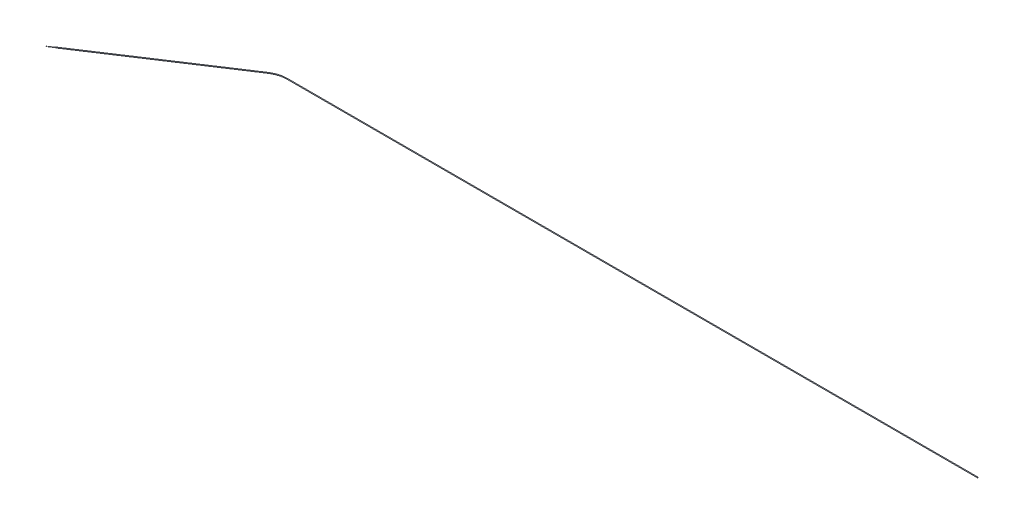
ISO-10303-21;
HEADER;
FILE_DESCRIPTION(('STEP AP214'),'2;1');
FILE_NAME('part.step','',(''),(''),'','','');
FILE_SCHEMA(('AUTOMOTIVE_DESIGN { 1 0 10303 214 1 1 1 1 }'));
ENDSEC;
DATA;
#1=APPLICATION_CONTEXT('core data for automotive mechanical design processes');
#2=APPLICATION_PROTOCOL_DEFINITION('international standard','automotive_design',2000,#1);
#3=PRODUCT_CONTEXT('',#1,'mechanical');
#4=PRODUCT('Part','Part','',(#3));
#5=PRODUCT_RELATED_PRODUCT_CATEGORY('part','',(#4));
#6=PRODUCT_DEFINITION_FORMATION('','',#4);
#7=PRODUCT_DEFINITION_CONTEXT('part definition',#1,'design');
#8=PRODUCT_DEFINITION('design','',#6,#7);
#9=PRODUCT_DEFINITION_SHAPE('','',#8);
#10=(LENGTH_UNIT() NAMED_UNIT(*) SI_UNIT(.MILLI.,.METRE.));
#11=(NAMED_UNIT(*) PLANE_ANGLE_UNIT() SI_UNIT($,.RADIAN.));
#12=(NAMED_UNIT(*) SI_UNIT($,.STERADIAN.) SOLID_ANGLE_UNIT());
#13=UNCERTAINTY_MEASURE_WITH_UNIT(LENGTH_MEASURE(1.E-05),#10,'distance_accuracy_value','');
#14=(GEOMETRIC_REPRESENTATION_CONTEXT(3) GLOBAL_UNCERTAINTY_ASSIGNED_CONTEXT((#13)) GLOBAL_UNIT_ASSIGNED_CONTEXT((#10,
#11,#12)) REPRESENTATION_CONTEXT('',''));
#15=CARTESIAN_POINT('',(0.,0.,0.));
#16=DIRECTION('',(0.,0.,1.));
#17=DIRECTION('',(1.,0.,0.));
#18=AXIS2_PLACEMENT_3D('',#15,#16,#17);
#19=CARTESIAN_POINT('',(500.,0.,-20.));
#20=DIRECTION('',(1.,0.,0.));
#21=DIRECTION('',(0.,0.,-1.));
#22=AXIS2_PLACEMENT_3D('',#19,#20,#21);
#23=PLANE('',#22);
#24=CARTESIAN_POINT('',(500.,0.,-20.));
#25=DIRECTION('',(1.,0.,0.));
#26=DIRECTION('',(0.,0.,-1.));
#27=AXIS2_PLACEMENT_3D('',#24,#25,#26);
#28=CIRCLE('',#27,0.249999999999997);
#29=CARTESIAN_POINT('',(500.,0.,-20.25));
#30=VERTEX_POINT('',#29);
#31=EDGE_CURVE('E59',#30,#30,#28,.T.);
#32=ORIENTED_EDGE('',*,*,#31,.T.);
#33=EDGE_LOOP('',(#32));
#34=FACE_BOUND('',#33,.T.);
#35=ADVANCED_FACE('F44',(#34),#23,.T.);
#36=CARTESIAN_POINT('',(-103.755073471841,0.,44.2253855704274));
#37=DIRECTION('',(0.835807361368269,0.,-0.549022817998133));
#38=DIRECTION('',(-0.549022817998133,0.,-0.835807361368269));
#39=AXIS2_PLACEMENT_3D('',#36,#37,#38);
#40=PLANE('',#39);
#41=CARTESIAN_POINT('',(-103.755073471841,0.,44.2253855704275));
#42=DIRECTION('',(-0.835807361368269,0.,0.549022817998133));
#43=DIRECTION('',(0.549022817998133,0.,0.835807361368269));
#44=AXIS2_PLACEMENT_3D('',#41,#42,#43);
#45=CIRCLE('',#44,0.1);
#46=CARTESIAN_POINT('',(-103.700171190041,0.,44.3089663065643));
#47=VERTEX_POINT('',#46);
#48=EDGE_CURVE('E11',#47,#47,#45,.T.);
#49=ORIENTED_EDGE('',*,*,#48,.F.);
#50=EDGE_LOOP('',(#49));
#51=FACE_BOUND('',#50,.T.);
#52=CARTESIAN_POINT('',(-103.755073471841,0.,44.2253855704274));
#53=DIRECTION('',(0.835807361368269,0.,-0.549022817998133));
#54=DIRECTION('',(-0.549022817998133,0.,-0.835807361368269));
#55=AXIS2_PLACEMENT_3D('',#52,#53,#54);
#56=CIRCLE('',#55,0.249999999999997);
#57=CARTESIAN_POINT('',(-103.89232917634,0.,44.0164337300854));
#58=VERTEX_POINT('',#57);
#59=EDGE_CURVE('E47',#58,#58,#56,.T.);
#60=ORIENTED_EDGE('',*,*,#59,.F.);
#61=EDGE_LOOP('',(#60));
#62=FACE_BOUND('',#61,.T.);
#63=ADVANCED_FACE('F85',(#51,#62),#40,.F.);
#64=CARTESIAN_POINT('',(500.,0.,-20.));
#65=DIRECTION('',(-1.,0.,0.));
#66=DIRECTION('',(0.,0.,1.));
#67=AXIS2_PLACEMENT_3D('',#64,#65,#66);
#68=CYLINDRICAL_SURFACE('',#67,0.249999999999997);
#69=CARTESIAN_POINT('',(0.,0.,-20.));
#70=DIRECTION('',(1.,0.,0.));
#71=DIRECTION('',(0.,0.,-1.));
#72=AXIS2_PLACEMENT_3D('',#69,#70,#71);
#73=CIRCLE('',#72,0.249999999999997);
#74=CARTESIAN_POINT('',(0.,0.,-20.25));
#75=VERTEX_POINT('',#74);
#76=EDGE_CURVE('E62',#75,#75,#73,.T.);
#77=ORIENTED_EDGE('',*,*,#76,.T.);
#78=EDGE_LOOP('',(#77));
#79=FACE_BOUND('',#78,.T.);
#80=ORIENTED_EDGE('',*,*,#31,.F.);
#81=EDGE_LOOP('',(#80));
#82=FACE_BOUND('',#81,.T.);
#83=ADVANCED_FACE('F82',(#79,#82),#68,.T.);
#84=CARTESIAN_POINT('',(0.,0.,0.));
#85=DIRECTION('',(0.,1.,0.));
#86=DIRECTION('',(0.,0.,1.));
#87=AXIS2_PLACEMENT_3D('',#84,#85,#86);
#88=TOROIDAL_SURFACE('',#87,20.,0.249999999999997);
#89=CARTESIAN_POINT('',(-10.9804563599627,0.,-16.7161472273653));
#90=DIRECTION('',(0.835807361368269,0.,-0.549022817998133));
#91=DIRECTION('',(-0.549022817998133,0.,-0.835807361368269));
#92=AXIS2_PLACEMENT_3D('',#89,#90,#91);
#93=CIRCLE('',#92,0.249999999999997);
#94=CARTESIAN_POINT('',(-11.1177120644622,0.,-16.9250990677074));
#95=VERTEX_POINT('',#94);
#96=EDGE_CURVE('E55',#95,#95,#93,.T.);
#97=CARTESIAN_POINT('',(0.,0.,0.));
#98=DIRECTION('',(0.,1.,0.));
#99=DIRECTION('',(0.,0.,1.));
#100=AXIS2_PLACEMENT_3D('',#97,#98,#99);
#101=CIRCLE('',#100,20.25);
#102=EDGE_CURVE('',#75,#95,#101,.T.);
#103=ORIENTED_EDGE('',*,*,#76,.F.);
#104=ORIENTED_EDGE('',*,*,#96,.T.);
#105=ORIENTED_EDGE('',*,*,#102,.T.);
#106=ORIENTED_EDGE('',*,*,#102,.F.);
#107=EDGE_LOOP('',(#103,#105,#104,#106));
#108=FACE_BOUND('',#107,.T.);
#109=ADVANCED_FACE('F67',(#108),#88,.T.);
#110=CARTESIAN_POINT('',(-10.9804563599627,0.,-16.7161472273654));
#111=DIRECTION('',(-0.835807361368269,0.,0.549022817998133));
#112=DIRECTION('',(0.549022817998133,0.,0.835807361368269));
#113=AXIS2_PLACEMENT_3D('',#110,#111,#112);
#114=CYLINDRICAL_SURFACE('',#113,0.249999999999997);
#115=ORIENTED_EDGE('',*,*,#59,.T.);
#116=EDGE_LOOP('',(#115));
#117=FACE_BOUND('',#116,.T.);
#118=ORIENTED_EDGE('',*,*,#96,.F.);
#119=EDGE_LOOP('',(#118));
#120=FACE_BOUND('',#119,.T.);
#121=ADVANCED_FACE('F70',(#117,#120),#114,.T.);
#122=CARTESIAN_POINT('',(-107.934110278682,0.,46.9704996604181));
#123=DIRECTION('',(0.835807361368269,0.,-0.549022817998133));
#124=DIRECTION('',(-0.549022817998133,0.,-0.835807361368269));
#125=AXIS2_PLACEMENT_3D('',#122,#123,#124);
#126=CYLINDRICAL_SURFACE('',#125,0.1);
#127=CARTESIAN_POINT('',(-107.934110278682,0.,46.9704996604181));
#128=DIRECTION('',(-0.835807361368269,0.,0.549022817998133));
#129=DIRECTION('',(0.549022817998133,0.,0.835807361368269));
#130=AXIS2_PLACEMENT_3D('',#127,#128,#129);
#131=CIRCLE('',#130,0.1);
#132=CARTESIAN_POINT('',(-107.879207996882,0.,47.054080396555));
#133=VERTEX_POINT('',#132);
#134=EDGE_CURVE('E58',#133,#133,#131,.T.);
#135=ORIENTED_EDGE('',*,*,#134,.F.);
#136=EDGE_LOOP('',(#135));
#137=FACE_BOUND('',#136,.T.);
#138=ORIENTED_EDGE('',*,*,#48,.T.);
#139=EDGE_LOOP('',(#138));
#140=FACE_BOUND('',#139,.T.);
#141=ADVANCED_FACE('F72',(#137,#140),#126,.T.);
#142=CARTESIAN_POINT('',(-107.934110278682,0.,46.9704996604181));
#143=DIRECTION('',(-0.835807361368269,0.,0.549022817998133));
#144=DIRECTION('',(0.549022817998133,0.,0.835807361368269));
#145=AXIS2_PLACEMENT_3D('',#142,#143,#144);
#146=PLANE('',#145);
#147=ORIENTED_EDGE('',*,*,#134,.T.);
#148=EDGE_LOOP('',(#147));
#149=FACE_BOUND('',#148,.T.);
#150=ADVANCED_FACE('F79',(#149),#146,.T.);
#151=CLOSED_SHELL('',(#35,#63,#83,#109,#121,#141,#150));
#152=MANIFOLD_SOLID_BREP('B2',#151);
#153=ADVANCED_BREP_SHAPE_REPRESENTATION('',(#18,#152),#14);
#154=SHAPE_DEFINITION_REPRESENTATION(#9,#153);
ENDSEC;
END-ISO-10303-21;
